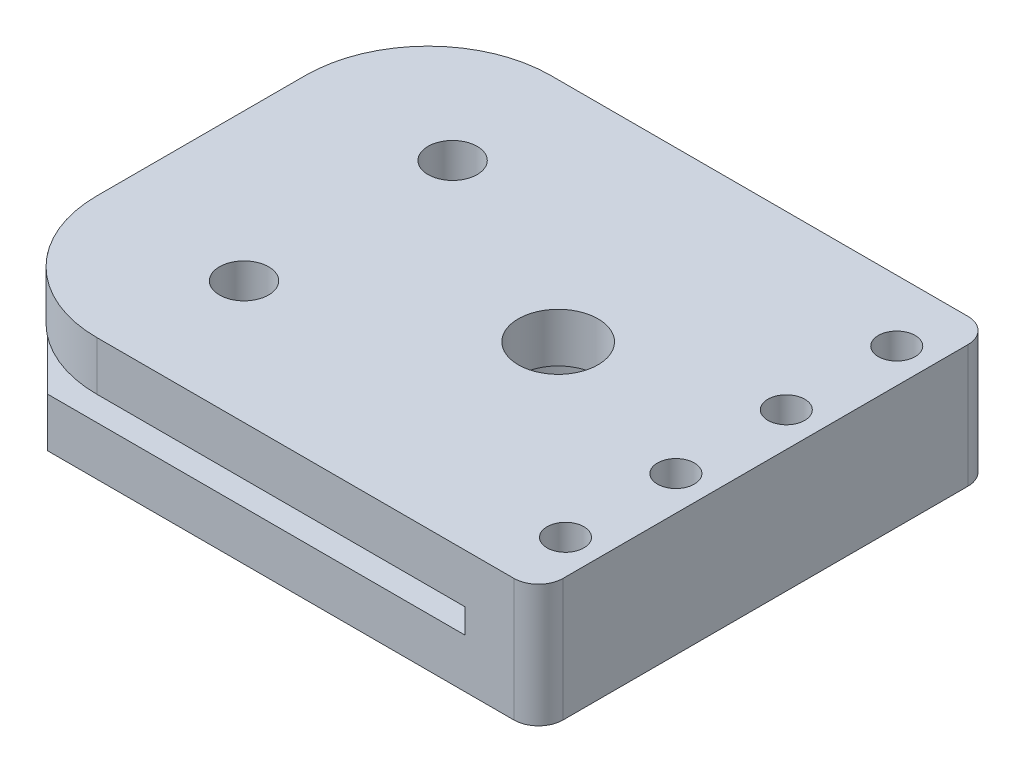
ISO-10303-21;
HEADER;
FILE_DESCRIPTION(('STEP AP214'),'2;1');
FILE_NAME('part.step','',(''),(''),'','','');
FILE_SCHEMA(('AUTOMOTIVE_DESIGN { 1 0 10303 214 1 1 1 1 }'));
ENDSEC;
DATA;
#1=APPLICATION_CONTEXT('core data for automotive mechanical design processes');
#2=APPLICATION_PROTOCOL_DEFINITION('international standard','automotive_design',2000,#1);
#3=PRODUCT_CONTEXT('',#1,'mechanical');
#4=PRODUCT('Part','Part','',(#3));
#5=PRODUCT_RELATED_PRODUCT_CATEGORY('part','',(#4));
#6=PRODUCT_DEFINITION_FORMATION('','',#4);
#7=PRODUCT_DEFINITION_CONTEXT('part definition',#1,'design');
#8=PRODUCT_DEFINITION('design','',#6,#7);
#9=PRODUCT_DEFINITION_SHAPE('','',#8);
#10=(LENGTH_UNIT() NAMED_UNIT(*) SI_UNIT(.MILLI.,.METRE.));
#11=(NAMED_UNIT(*) PLANE_ANGLE_UNIT() SI_UNIT($,.RADIAN.));
#12=(NAMED_UNIT(*) SI_UNIT($,.STERADIAN.) SOLID_ANGLE_UNIT());
#13=UNCERTAINTY_MEASURE_WITH_UNIT(LENGTH_MEASURE(1.E-05),#10,'distance_accuracy_value','');
#14=(GEOMETRIC_REPRESENTATION_CONTEXT(3) GLOBAL_UNCERTAINTY_ASSIGNED_CONTEXT((#13)) GLOBAL_UNIT_ASSIGNED_CONTEXT((#10,
#11,#12)) REPRESENTATION_CONTEXT('',''));
#15=CARTESIAN_POINT('',(0.,0.,0.));
#16=DIRECTION('',(0.,0.,1.));
#17=DIRECTION('',(1.,0.,0.));
#18=AXIS2_PLACEMENT_3D('',#15,#16,#17);
#19=CARTESIAN_POINT('',(19.,10.,-18.5));
#20=DIRECTION('',(1.,0.,0.));
#21=DIRECTION('',(0.,0.,-1.));
#22=AXIS2_PLACEMENT_3D('',#19,#20,#21);
#23=PLANE('',#22);
#24=DIRECTION('',(0.,0.,1.));
#25=VECTOR('',#24,1.);
#26=CARTESIAN_POINT('',(19.,6.,-18.5));
#27=LINE('',#26,#25);
#28=CARTESIAN_POINT('',(19.,6.,-18.5));
#29=VERTEX_POINT('',#28);
#30=CARTESIAN_POINT('',(19.,6.,18.5));
#31=VERTEX_POINT('',#30);
#32=EDGE_CURVE('E141',#29,#31,#27,.T.);
#33=ORIENTED_EDGE('',*,*,#32,.F.);
#34=DIRECTION('',(0.,-1.,0.));
#35=VECTOR('',#34,1.);
#36=CARTESIAN_POINT('',(19.,10.,-18.5));
#37=LINE('',#36,#35);
#38=CARTESIAN_POINT('',(19.,4.,-18.5));
#39=VERTEX_POINT('',#38);
#40=EDGE_CURVE('E154',#29,#39,#37,.T.);
#41=ORIENTED_EDGE('',*,*,#40,.T.);
#42=DIRECTION('',(0.,0.,1.));
#43=VECTOR('',#42,1.);
#44=CARTESIAN_POINT('',(19.,4.,-18.5));
#45=LINE('',#44,#43);
#46=CARTESIAN_POINT('',(19.,4.,18.5));
#47=VERTEX_POINT('',#46);
#48=EDGE_CURVE('E149',#39,#47,#45,.T.);
#49=ORIENTED_EDGE('',*,*,#48,.T.);
#50=DIRECTION('',(0.,-1.,0.));
#51=VECTOR('',#50,1.);
#52=CARTESIAN_POINT('',(19.,10.,18.5));
#53=LINE('',#52,#51);
#54=EDGE_CURVE('E156',#31,#47,#53,.T.);
#55=ORIENTED_EDGE('',*,*,#54,.F.);
#56=EDGE_LOOP('',(#33,#41,#49,#55));
#57=FACE_BOUND('',#56,.T.);
#58=ADVANCED_FACE('F33',(#57),#23,.F.);
#59=CARTESIAN_POINT('',(0.,4.,0.));
#60=DIRECTION('',(0.,-1.,0.));
#61=DIRECTION('',(0.,0.,-1.));
#62=AXIS2_PLACEMENT_3D('',#59,#60,#61);
#63=PLANE('',#62);
#64=CARTESIAN_POINT('',(8.10258170341882,4.,0.));
#65=DIRECTION('',(0.,-1.,0.));
#66=DIRECTION('',(0.,0.,-1.));
#67=AXIS2_PLACEMENT_3D('',#64,#65,#66);
#68=CIRCLE('',#67,7.5);
#69=CARTESIAN_POINT('',(8.10258170341882,4.,-7.5));
#70=VERTEX_POINT('',#69);
#71=EDGE_CURVE('E322',#70,#70,#68,.T.);
#72=ORIENTED_EDGE('',*,*,#71,.T.);
#73=EDGE_LOOP('',(#72));
#74=FACE_BOUND('',#73,.T.);
#75=CARTESIAN_POINT('',(-8.99999999999999,4.,-8.5));
#76=DIRECTION('',(0.,-1.,0.));
#77=DIRECTION('',(0.,0.,-1.));
#78=AXIS2_PLACEMENT_3D('',#75,#76,#77);
#79=CIRCLE('',#78,2.);
#80=CARTESIAN_POINT('',(-8.99999999999999,4.,-10.5));
#81=VERTEX_POINT('',#80);
#82=EDGE_CURVE('E313',#81,#81,#79,.T.);
#83=ORIENTED_EDGE('',*,*,#82,.T.);
#84=EDGE_LOOP('',(#83));
#85=FACE_BOUND('',#84,.T.);
#86=CARTESIAN_POINT('',(-8.99999999999999,4.,8.5));
#87=DIRECTION('',(0.,-1.,0.));
#88=DIRECTION('',(0.,0.,-1.));
#89=AXIS2_PLACEMENT_3D('',#86,#87,#88);
#90=CIRCLE('',#89,2.);
#91=CARTESIAN_POINT('',(-8.99999999999999,4.,6.5));
#92=VERTEX_POINT('',#91);
#93=EDGE_CURVE('E158',#92,#92,#90,.T.);
#94=ORIENTED_EDGE('',*,*,#93,.T.);
#95=EDGE_LOOP('',(#94));
#96=FACE_BOUND('',#95,.T.);
#97=ORIENTED_EDGE('',*,*,#48,.F.);
#98=DIRECTION('',(-1.,0.,0.));
#99=VECTOR('',#98,1.);
#100=CARTESIAN_POINT('',(-25.,4.,-18.5));
#101=LINE('',#100,#99);
#102=CARTESIAN_POINT('',(-15.,4.,-18.5));
#103=VERTEX_POINT('',#102);
#104=EDGE_CURVE('E163',#39,#103,#101,.T.);
#105=ORIENTED_EDGE('',*,*,#104,.T.);
#106=DIRECTION('',(0.707106781186549,0.,-0.707106781186546));
#107=VECTOR('',#106,1.);
#108=CARTESIAN_POINT('',(-25.,4.,-8.5));
#109=LINE('',#108,#107);
#110=CARTESIAN_POINT('',(-25.,4.,-8.49999999999999));
#111=VERTEX_POINT('',#110);
#112=EDGE_CURVE('E202',#103,#111,#109,.F.);
#113=ORIENTED_EDGE('',*,*,#112,.T.);
#114=DIRECTION('',(0.,0.,1.));
#115=VECTOR('',#114,1.);
#116=CARTESIAN_POINT('',(-25.,4.,18.5));
#117=LINE('',#116,#115);
#118=CARTESIAN_POINT('',(-25.,4.,8.49999999999996));
#119=VERTEX_POINT('',#118);
#120=EDGE_CURVE('E189',#111,#119,#117,.T.);
#121=ORIENTED_EDGE('',*,*,#120,.T.);
#122=DIRECTION('',(-0.707106781186546,0.,-0.707106781186549));
#123=VECTOR('',#122,1.);
#124=CARTESIAN_POINT('',(-15.,4.,18.5));
#125=LINE('',#124,#123);
#126=CARTESIAN_POINT('',(-15.,4.,18.5));
#127=VERTEX_POINT('',#126);
#128=EDGE_CURVE('E200',#119,#127,#125,.F.);
#129=ORIENTED_EDGE('',*,*,#128,.T.);
#130=DIRECTION('',(1.,0.,0.));
#131=VECTOR('',#130,1.);
#132=CARTESIAN_POINT('',(-25.,4.,18.5));
#133=LINE('',#132,#131);
#134=EDGE_CURVE('E192',#127,#47,#133,.T.);
#135=ORIENTED_EDGE('',*,*,#134,.T.);
#136=EDGE_LOOP('',(#97,#105,#113,#121,#129,#135));
#137=FACE_BOUND('',#136,.T.);
#138=ADVANCED_FACE('F233',(#74,#85,#96,#137),#63,.F.);
#139=CARTESIAN_POINT('',(25.,4.,18.5));
#140=DIRECTION('',(-1.,0.,0.));
#141=DIRECTION('',(0.,0.,1.));
#142=AXIS2_PLACEMENT_3D('',#139,#140,#141);
#143=PLANE('',#142);
#144=DIRECTION('',(0.,0.,-1.));
#145=VECTOR('',#144,1.);
#146=CARTESIAN_POINT('',(25.,10.,-18.5));
#147=LINE('',#146,#145);
#148=CARTESIAN_POINT('',(25.,10.,16.5));
#149=VERTEX_POINT('',#148);
#150=CARTESIAN_POINT('',(25.,10.,-16.5));
#151=VERTEX_POINT('',#150);
#152=EDGE_CURVE('E181',#149,#151,#147,.T.);
#153=ORIENTED_EDGE('',*,*,#152,.F.);
#154=DIRECTION('',(0.,-1.,0.));
#155=VECTOR('',#154,1.);
#156=CARTESIAN_POINT('',(25.,4.,16.5));
#157=LINE('',#156,#155);
#158=CARTESIAN_POINT('',(25.,0.,16.5));
#159=VERTEX_POINT('',#158);
#160=EDGE_CURVE('E262',#149,#159,#157,.T.);
#161=ORIENTED_EDGE('',*,*,#160,.T.);
#162=DIRECTION('',(0.,0.,-1.));
#163=VECTOR('',#162,1.);
#164=CARTESIAN_POINT('',(25.,0.,18.5));
#165=LINE('',#164,#163);
#166=CARTESIAN_POINT('',(25.,0.,-16.5));
#167=VERTEX_POINT('',#166);
#168=EDGE_CURVE('E164',#159,#167,#165,.T.);
#169=ORIENTED_EDGE('',*,*,#168,.T.);
#170=DIRECTION('',(0.,-1.,0.));
#171=VECTOR('',#170,1.);
#172=CARTESIAN_POINT('',(25.,4.,-16.5));
#173=LINE('',#172,#171);
#174=EDGE_CURVE('E271',#167,#151,#173,.F.);
#175=ORIENTED_EDGE('',*,*,#174,.T.);
#176=EDGE_LOOP('',(#153,#161,#169,#175));
#177=FACE_BOUND('',#176,.T.);
#178=ADVANCED_FACE('F399',(#177),#143,.F.);
#179=CARTESIAN_POINT('',(-25.,4.,-18.5));
#180=DIRECTION('',(0.,0.,1.));
#181=DIRECTION('',(1.,0.,0.));
#182=AXIS2_PLACEMENT_3D('',#179,#180,#181);
#183=PLANE('',#182);
#184=DIRECTION('',(-1.,0.,0.));
#185=VECTOR('',#184,1.);
#186=CARTESIAN_POINT('',(25.,10.,-18.5));
#187=LINE('',#186,#185);
#188=CARTESIAN_POINT('',(23.,10.,-18.5));
#189=VERTEX_POINT('',#188);
#190=CARTESIAN_POINT('',(-11.,10.,-18.5));
#191=VERTEX_POINT('',#190);
#192=EDGE_CURVE('E252',#189,#191,#187,.T.);
#193=ORIENTED_EDGE('',*,*,#192,.F.);
#194=DIRECTION('',(0.,-1.,0.));
#195=VECTOR('',#194,1.);
#196=CARTESIAN_POINT('',(23.,4.,-18.5));
#197=LINE('',#196,#195);
#198=CARTESIAN_POINT('',(23.,0.,-18.5));
#199=VERTEX_POINT('',#198);
#200=EDGE_CURVE('E11',#189,#199,#197,.T.);
#201=ORIENTED_EDGE('',*,*,#200,.T.);
#202=DIRECTION('',(-1.,0.,0.));
#203=VECTOR('',#202,1.);
#204=CARTESIAN_POINT('',(-25.,0.,-18.5));
#205=LINE('',#204,#203);
#206=CARTESIAN_POINT('',(-15.,0.,-18.5));
#207=VERTEX_POINT('',#206);
#208=EDGE_CURVE('E167',#199,#207,#205,.T.);
#209=ORIENTED_EDGE('',*,*,#208,.T.);
#210=DIRECTION('',(0.,1.,0.));
#211=VECTOR('',#210,1.);
#212=CARTESIAN_POINT('',(-15.,4.,-18.5));
#213=LINE('',#212,#211);
#214=EDGE_CURVE('E198',#207,#103,#213,.T.);
#215=ORIENTED_EDGE('',*,*,#214,.T.);
#216=ORIENTED_EDGE('',*,*,#104,.F.);
#217=ORIENTED_EDGE('',*,*,#40,.F.);
#218=DIRECTION('',(1.,0.,0.));
#219=VECTOR('',#218,1.);
#220=CARTESIAN_POINT('',(-21.,6.,-18.5));
#221=LINE('',#220,#219);
#222=CARTESIAN_POINT('',(-11.,6.,-18.5));
#223=VERTEX_POINT('',#222);
#224=EDGE_CURVE('E137',#223,#29,#221,.T.);
#225=ORIENTED_EDGE('',*,*,#224,.F.);
#226=DIRECTION('',(0.,-1.,0.));
#227=VECTOR('',#226,1.);
#228=CARTESIAN_POINT('',(-11.,10.,-18.5));
#229=LINE('',#228,#227);
#230=EDGE_CURVE('E273',#223,#191,#229,.F.);
#231=ORIENTED_EDGE('',*,*,#230,.T.);
#232=EDGE_LOOP('',(#193,#201,#209,#215,#216,#217,#225,#231));
#233=FACE_BOUND('',#232,.T.);
#234=ADVANCED_FACE('F161',(#233),#183,.F.);
#235=CARTESIAN_POINT('',(-25.,4.,18.5));
#236=DIRECTION('',(1.,0.,0.));
#237=DIRECTION('',(0.,0.,-1.));
#238=AXIS2_PLACEMENT_3D('',#235,#236,#237);
#239=PLANE('',#238);
#240=DIRECTION('',(0.,0.,1.));
#241=VECTOR('',#240,1.);
#242=CARTESIAN_POINT('',(-25.,0.,18.5));
#243=LINE('',#242,#241);
#244=CARTESIAN_POINT('',(-25.,0.,-8.49999999999999));
#245=VERTEX_POINT('',#244);
#246=CARTESIAN_POINT('',(-25.,0.,8.49999999999996));
#247=VERTEX_POINT('',#246);
#248=EDGE_CURVE('E218',#245,#247,#243,.T.);
#249=ORIENTED_EDGE('',*,*,#248,.T.);
#250=DIRECTION('',(0.,1.,0.));
#251=VECTOR('',#250,1.);
#252=CARTESIAN_POINT('',(-25.,4.,8.49999999999996));
#253=LINE('',#252,#251);
#254=EDGE_CURVE('E204',#247,#119,#253,.T.);
#255=ORIENTED_EDGE('',*,*,#254,.T.);
#256=ORIENTED_EDGE('',*,*,#120,.F.);
#257=DIRECTION('',(0.,-1.,0.));
#258=VECTOR('',#257,1.);
#259=CARTESIAN_POINT('',(-25.,4.,-8.5));
#260=LINE('',#259,#258);
#261=EDGE_CURVE('E206',#111,#245,#260,.T.);
#262=ORIENTED_EDGE('',*,*,#261,.T.);
#263=EDGE_LOOP('',(#249,#255,#256,#262));
#264=FACE_BOUND('',#263,.T.);
#265=ADVANCED_FACE('F236',(#264),#239,.F.);
#266=CARTESIAN_POINT('',(-25.,4.,18.5));
#267=DIRECTION('',(0.,0.,-1.));
#268=DIRECTION('',(-1.,0.,0.));
#269=AXIS2_PLACEMENT_3D('',#266,#267,#268);
#270=PLANE('',#269);
#271=DIRECTION('',(1.,0.,0.));
#272=VECTOR('',#271,1.);
#273=CARTESIAN_POINT('',(-25.,0.,18.5));
#274=LINE('',#273,#272);
#275=CARTESIAN_POINT('',(-15.,0.,18.5));
#276=VERTEX_POINT('',#275);
#277=CARTESIAN_POINT('',(23.,0.,18.5));
#278=VERTEX_POINT('',#277);
#279=EDGE_CURVE('E216',#276,#278,#274,.T.);
#280=ORIENTED_EDGE('',*,*,#279,.T.);
#281=DIRECTION('',(0.,-1.,0.));
#282=VECTOR('',#281,1.);
#283=CARTESIAN_POINT('',(23.,4.,18.5));
#284=LINE('',#283,#282);
#285=CARTESIAN_POINT('',(23.,10.,18.5));
#286=VERTEX_POINT('',#285);
#287=EDGE_CURVE('E56',#278,#286,#284,.F.);
#288=ORIENTED_EDGE('',*,*,#287,.T.);
#289=DIRECTION('',(1.,0.,0.));
#290=VECTOR('',#289,1.);
#291=CARTESIAN_POINT('',(25.,10.,18.5));
#292=LINE('',#291,#290);
#293=CARTESIAN_POINT('',(-11.,10.,18.5));
#294=VERTEX_POINT('',#293);
#295=EDGE_CURVE('E169',#294,#286,#292,.T.);
#296=ORIENTED_EDGE('',*,*,#295,.F.);
#297=DIRECTION('',(0.,1.,0.));
#298=VECTOR('',#297,1.);
#299=CARTESIAN_POINT('',(-11.,6.,18.5));
#300=LINE('',#299,#298);
#301=CARTESIAN_POINT('',(-11.,6.,18.5));
#302=VERTEX_POINT('',#301);
#303=EDGE_CURVE('E245',#294,#302,#300,.F.);
#304=ORIENTED_EDGE('',*,*,#303,.T.);
#305=DIRECTION('',(1.,0.,0.));
#306=VECTOR('',#305,1.);
#307=CARTESIAN_POINT('',(-21.,6.,18.5));
#308=LINE('',#307,#306);
#309=EDGE_CURVE('E150',#302,#31,#308,.T.);
#310=ORIENTED_EDGE('',*,*,#309,.T.);
#311=ORIENTED_EDGE('',*,*,#54,.T.);
#312=ORIENTED_EDGE('',*,*,#134,.F.);
#313=DIRECTION('',(0.,-1.,0.));
#314=VECTOR('',#313,1.);
#315=CARTESIAN_POINT('',(-15.,4.,18.5));
#316=LINE('',#315,#314);
#317=EDGE_CURVE('E197',#127,#276,#316,.T.);
#318=ORIENTED_EDGE('',*,*,#317,.T.);
#319=EDGE_LOOP('',(#280,#288,#296,#304,#310,#311,#312,#318));
#320=FACE_BOUND('',#319,.T.);
#321=ADVANCED_FACE('F242',(#320),#270,.F.);
#322=CARTESIAN_POINT('',(0.,0.,0.));
#323=DIRECTION('',(0.,-1.,0.));
#324=DIRECTION('',(0.,0.,-1.));
#325=AXIS2_PLACEMENT_3D('',#322,#323,#324);
#326=PLANE('',#325);
#327=CARTESIAN_POINT('',(8.10258170341882,0.,0.));
#328=DIRECTION('',(0.,-1.,0.));
#329=DIRECTION('',(0.,0.,-1.));
#330=AXIS2_PLACEMENT_3D('',#327,#328,#329);
#331=CIRCLE('',#330,7.5);
#332=CARTESIAN_POINT('',(8.10258170341882,0.,-7.5));
#333=VERTEX_POINT('',#332);
#334=EDGE_CURVE('E325',#333,#333,#331,.T.);
#335=ORIENTED_EDGE('',*,*,#334,.F.);
#336=EDGE_LOOP('',(#335));
#337=FACE_BOUND('',#336,.T.);
#338=CARTESIAN_POINT('',(-8.99999999999999,0.,-8.5));
#339=DIRECTION('',(0.,-1.,0.));
#340=DIRECTION('',(0.,0.,-1.));
#341=AXIS2_PLACEMENT_3D('',#338,#339,#340);
#342=CIRCLE('',#341,2.);
#343=CARTESIAN_POINT('',(-8.99999999999999,0.,-10.5));
#344=VERTEX_POINT('',#343);
#345=EDGE_CURVE('E282',#344,#344,#342,.T.);
#346=ORIENTED_EDGE('',*,*,#345,.F.);
#347=EDGE_LOOP('',(#346));
#348=FACE_BOUND('',#347,.T.);
#349=CARTESIAN_POINT('',(-8.99999999999999,0.,8.5));
#350=DIRECTION('',(0.,-1.,0.));
#351=DIRECTION('',(0.,0.,-1.));
#352=AXIS2_PLACEMENT_3D('',#349,#350,#351);
#353=CIRCLE('',#352,2.);
#354=CARTESIAN_POINT('',(-8.99999999999999,0.,6.5));
#355=VERTEX_POINT('',#354);
#356=EDGE_CURVE('E286',#355,#355,#353,.T.);
#357=ORIENTED_EDGE('',*,*,#356,.F.);
#358=EDGE_LOOP('',(#357));
#359=FACE_BOUND('',#358,.T.);
#360=ORIENTED_EDGE('',*,*,#168,.F.);
#361=CARTESIAN_POINT('',(23.,0.,16.5));
#362=DIRECTION('',(0.,-1.,0.));
#363=DIRECTION('',(0.,0.,-1.));
#364=AXIS2_PLACEMENT_3D('',#361,#362,#363);
#365=CIRCLE('',#364,2.);
#366=EDGE_CURVE('E266',#159,#278,#365,.T.);
#367=ORIENTED_EDGE('',*,*,#366,.T.);
#368=ORIENTED_EDGE('',*,*,#279,.F.);
#369=DIRECTION('',(0.707106781186546,0.,0.707106781186549));
#370=VECTOR('',#369,1.);
#371=CARTESIAN_POINT('',(-16.75,0.,16.75));
#372=LINE('',#371,#370);
#373=EDGE_CURVE('E209',#276,#247,#372,.F.);
#374=ORIENTED_EDGE('',*,*,#373,.T.);
#375=ORIENTED_EDGE('',*,*,#248,.F.);
#376=DIRECTION('',(-0.707106781186549,0.,0.707106781186546));
#377=VECTOR('',#376,1.);
#378=CARTESIAN_POINT('',(-16.75,0.,-16.75));
#379=LINE('',#378,#377);
#380=EDGE_CURVE('E211',#245,#207,#379,.F.);
#381=ORIENTED_EDGE('',*,*,#380,.T.);
#382=ORIENTED_EDGE('',*,*,#208,.F.);
#383=CARTESIAN_POINT('',(23.,0.,-16.5));
#384=DIRECTION('',(0.,-1.,0.));
#385=DIRECTION('',(0.,0.,-1.));
#386=AXIS2_PLACEMENT_3D('',#383,#384,#385);
#387=CIRCLE('',#386,2.);
#388=EDGE_CURVE('E268',#199,#167,#387,.T.);
#389=ORIENTED_EDGE('',*,*,#388,.T.);
#390=EDGE_LOOP('',(#360,#367,#368,#374,#375,#381,#382,#389));
#391=FACE_BOUND('',#390,.T.);
#392=ADVANCED_FACE('F227',(#337,#348,#359,#391),#326,.T.);
#393=CARTESIAN_POINT('',(-15.,4.,18.5));
#394=DIRECTION('',(0.707106781186549,0.,-0.707106781186546));
#395=DIRECTION('',(0.,-1.,0.));
#396=AXIS2_PLACEMENT_3D('',#393,#394,#395);
#397=PLANE('',#396);
#398=ORIENTED_EDGE('',*,*,#128,.F.);
#399=ORIENTED_EDGE('',*,*,#254,.F.);
#400=ORIENTED_EDGE('',*,*,#373,.F.);
#401=ORIENTED_EDGE('',*,*,#317,.F.);
#402=EDGE_LOOP('',(#398,#399,#400,#401));
#403=FACE_BOUND('',#402,.T.);
#404=ADVANCED_FACE('F239',(#403),#397,.F.);
#405=CARTESIAN_POINT('',(-25.,4.,-8.5));
#406=DIRECTION('',(0.707106781186546,0.,0.707106781186549));
#407=DIRECTION('',(0.,-1.,0.));
#408=AXIS2_PLACEMENT_3D('',#405,#406,#407);
#409=PLANE('',#408);
#410=ORIENTED_EDGE('',*,*,#112,.F.);
#411=ORIENTED_EDGE('',*,*,#214,.F.);
#412=ORIENTED_EDGE('',*,*,#380,.F.);
#413=ORIENTED_EDGE('',*,*,#261,.F.);
#414=EDGE_LOOP('',(#410,#411,#412,#413));
#415=FACE_BOUND('',#414,.T.);
#416=ADVANCED_FACE('F230',(#415),#409,.F.);
#417=CARTESIAN_POINT('',(0.,10.,0.));
#418=DIRECTION('',(0.,-1.,0.));
#419=DIRECTION('',(0.,0.,-1.));
#420=AXIS2_PLACEMENT_3D('',#417,#418,#419);
#421=PLANE('',#420);
#422=CARTESIAN_POINT('',(22.2,10.,13.5));
#423=DIRECTION('',(0.,1.,0.));
#424=DIRECTION('',(0.,0.,1.));
#425=AXIS2_PLACEMENT_3D('',#422,#423,#424);
#426=CIRCLE('',#425,1.5);
#427=CARTESIAN_POINT('',(22.2,10.,15.));
#428=VERTEX_POINT('',#427);
#429=EDGE_CURVE('E347',#428,#428,#426,.T.);
#430=ORIENTED_EDGE('',*,*,#429,.F.);
#431=EDGE_LOOP('',(#430));
#432=FACE_BOUND('',#431,.T.);
#433=CARTESIAN_POINT('',(22.2,10.,4.5));
#434=DIRECTION('',(0.,1.,0.));
#435=DIRECTION('',(0.,0.,1.));
#436=AXIS2_PLACEMENT_3D('',#433,#434,#435);
#437=CIRCLE('',#436,1.5);
#438=CARTESIAN_POINT('',(22.2,10.,6.));
#439=VERTEX_POINT('',#438);
#440=EDGE_CURVE('E341',#439,#439,#437,.T.);
#441=ORIENTED_EDGE('',*,*,#440,.F.);
#442=EDGE_LOOP('',(#441));
#443=FACE_BOUND('',#442,.T.);
#444=CARTESIAN_POINT('',(22.2,10.,-4.5));
#445=DIRECTION('',(0.,1.,0.));
#446=DIRECTION('',(0.,0.,1.));
#447=AXIS2_PLACEMENT_3D('',#444,#445,#446);
#448=CIRCLE('',#447,1.5);
#449=CARTESIAN_POINT('',(22.2,10.,-3.));
#450=VERTEX_POINT('',#449);
#451=EDGE_CURVE('E335',#450,#450,#448,.T.);
#452=ORIENTED_EDGE('',*,*,#451,.F.);
#453=EDGE_LOOP('',(#452));
#454=FACE_BOUND('',#453,.T.);
#455=CARTESIAN_POINT('',(22.2,10.,-13.5));
#456=DIRECTION('',(0.,1.,0.));
#457=DIRECTION('',(0.,0.,1.));
#458=AXIS2_PLACEMENT_3D('',#455,#456,#457);
#459=CIRCLE('',#458,1.5);
#460=CARTESIAN_POINT('',(22.2,10.,-12.));
#461=VERTEX_POINT('',#460);
#462=EDGE_CURVE('E329',#461,#461,#459,.T.);
#463=ORIENTED_EDGE('',*,*,#462,.F.);
#464=EDGE_LOOP('',(#463));
#465=FACE_BOUND('',#464,.T.);
#466=CARTESIAN_POINT('',(8.10258170341882,10.,0.));
#467=DIRECTION('',(0.,1.,0.));
#468=DIRECTION('',(0.,0.,1.));
#469=AXIS2_PLACEMENT_3D('',#466,#467,#468);
#470=CIRCLE('',#469,3.25);
#471=CARTESIAN_POINT('',(8.10258170341882,10.,3.25));
#472=VERTEX_POINT('',#471);
#473=EDGE_CURVE('E278',#472,#472,#470,.T.);
#474=ORIENTED_EDGE('',*,*,#473,.F.);
#475=EDGE_LOOP('',(#474));
#476=FACE_BOUND('',#475,.T.);
#477=CARTESIAN_POINT('',(-8.99999999999999,10.,-8.5));
#478=DIRECTION('',(0.,1.,0.));
#479=DIRECTION('',(0.,0.,1.));
#480=AXIS2_PLACEMENT_3D('',#477,#478,#479);
#481=CIRCLE('',#480,2.);
#482=CARTESIAN_POINT('',(-8.99999999999999,10.,-6.5));
#483=VERTEX_POINT('',#482);
#484=EDGE_CURVE('E277',#483,#483,#481,.T.);
#485=ORIENTED_EDGE('',*,*,#484,.F.);
#486=EDGE_LOOP('',(#485));
#487=FACE_BOUND('',#486,.T.);
#488=CARTESIAN_POINT('',(-8.99999999999999,10.,8.5));
#489=DIRECTION('',(0.,1.,0.));
#490=DIRECTION('',(0.,0.,1.));
#491=AXIS2_PLACEMENT_3D('',#488,#489,#490);
#492=CIRCLE('',#491,2.);
#493=CARTESIAN_POINT('',(-8.99999999999999,10.,10.5));
#494=VERTEX_POINT('',#493);
#495=EDGE_CURVE('E287',#494,#494,#492,.T.);
#496=ORIENTED_EDGE('',*,*,#495,.F.);
#497=EDGE_LOOP('',(#496));
#498=FACE_BOUND('',#497,.T.);
#499=ORIENTED_EDGE('',*,*,#295,.T.);
#500=CARTESIAN_POINT('',(23.,10.,16.5));
#501=DIRECTION('',(0.,-1.,0.));
#502=DIRECTION('',(0.,0.,-1.));
#503=AXIS2_PLACEMENT_3D('',#500,#501,#502);
#504=CIRCLE('',#503,2.);
#505=EDGE_CURVE('E41',#286,#149,#504,.F.);
#506=ORIENTED_EDGE('',*,*,#505,.T.);
#507=ORIENTED_EDGE('',*,*,#152,.T.);
#508=CARTESIAN_POINT('',(23.,10.,-16.5));
#509=DIRECTION('',(0.,-1.,0.));
#510=DIRECTION('',(0.,0.,-1.));
#511=AXIS2_PLACEMENT_3D('',#508,#509,#510);
#512=CIRCLE('',#511,2.);
#513=EDGE_CURVE('E48',#151,#189,#512,.F.);
#514=ORIENTED_EDGE('',*,*,#513,.T.);
#515=ORIENTED_EDGE('',*,*,#192,.T.);
#516=CARTESIAN_POINT('',(-11.,10.,-8.5));
#517=DIRECTION('',(0.,-1.,0.));
#518=DIRECTION('',(0.,0.,-1.));
#519=AXIS2_PLACEMENT_3D('',#516,#517,#518);
#520=CIRCLE('',#519,10.);
#521=CARTESIAN_POINT('',(-21.,10.,-8.5));
#522=VERTEX_POINT('',#521);
#523=EDGE_CURVE('E294',#191,#522,#520,.F.);
#524=ORIENTED_EDGE('',*,*,#523,.T.);
#525=DIRECTION('',(0.,0.,-1.));
#526=VECTOR('',#525,1.);
#527=CARTESIAN_POINT('',(-21.,10.,-18.5));
#528=LINE('',#527,#526);
#529=CARTESIAN_POINT('',(-21.,10.,8.5));
#530=VERTEX_POINT('',#529);
#531=EDGE_CURVE('E247',#530,#522,#528,.T.);
#532=ORIENTED_EDGE('',*,*,#531,.F.);
#533=CARTESIAN_POINT('',(-11.,10.,8.5));
#534=DIRECTION('',(0.,-1.,0.));
#535=DIRECTION('',(0.,0.,-1.));
#536=AXIS2_PLACEMENT_3D('',#533,#534,#535);
#537=CIRCLE('',#536,10.);
#538=EDGE_CURVE('E257',#530,#294,#537,.F.);
#539=ORIENTED_EDGE('',*,*,#538,.T.);
#540=EDGE_LOOP('',(#499,#506,#507,#514,#515,#524,#532,#539));
#541=FACE_BOUND('',#540,.T.);
#542=ADVANCED_FACE('F254',(#432,#443,#454,#465,#476,#487,#498,#541),#421,.F.);
#543=CARTESIAN_POINT('',(-21.,6.,-18.5));
#544=DIRECTION('',(0.,1.,0.));
#545=DIRECTION('',(0.,0.,1.));
#546=AXIS2_PLACEMENT_3D('',#543,#544,#545);
#547=PLANE('',#546);
#548=CARTESIAN_POINT('',(8.10258170341882,6.,0.));
#549=DIRECTION('',(0.,1.,0.));
#550=DIRECTION('',(0.,0.,1.));
#551=AXIS2_PLACEMENT_3D('',#548,#549,#550);
#552=CIRCLE('',#551,3.25);
#553=CARTESIAN_POINT('',(8.10258170341882,6.,3.25));
#554=VERTEX_POINT('',#553);
#555=EDGE_CURVE('E274',#554,#554,#552,.T.);
#556=ORIENTED_EDGE('',*,*,#555,.T.);
#557=EDGE_LOOP('',(#556));
#558=FACE_BOUND('',#557,.T.);
#559=CARTESIAN_POINT('',(-8.99999999999999,6.,-8.5));
#560=DIRECTION('',(0.,1.,0.));
#561=DIRECTION('',(0.,0.,1.));
#562=AXIS2_PLACEMENT_3D('',#559,#560,#561);
#563=CIRCLE('',#562,2.);
#564=CARTESIAN_POINT('',(-8.99999999999999,6.,-6.5));
#565=VERTEX_POINT('',#564);
#566=EDGE_CURVE('E279',#565,#565,#563,.T.);
#567=ORIENTED_EDGE('',*,*,#566,.T.);
#568=EDGE_LOOP('',(#567));
#569=FACE_BOUND('',#568,.T.);
#570=CARTESIAN_POINT('',(-8.99999999999999,6.,8.5));
#571=DIRECTION('',(0.,1.,0.));
#572=DIRECTION('',(0.,0.,1.));
#573=AXIS2_PLACEMENT_3D('',#570,#571,#572);
#574=CIRCLE('',#573,2.);
#575=CARTESIAN_POINT('',(-8.99999999999999,6.,10.5));
#576=VERTEX_POINT('',#575);
#577=EDGE_CURVE('E283',#576,#576,#574,.T.);
#578=ORIENTED_EDGE('',*,*,#577,.T.);
#579=EDGE_LOOP('',(#578));
#580=FACE_BOUND('',#579,.T.);
#581=ORIENTED_EDGE('',*,*,#309,.F.);
#582=CARTESIAN_POINT('',(-11.,6.,8.5));
#583=DIRECTION('',(0.,1.,0.));
#584=DIRECTION('',(0.,0.,1.));
#585=AXIS2_PLACEMENT_3D('',#582,#583,#584);
#586=CIRCLE('',#585,10.);
#587=CARTESIAN_POINT('',(-21.,6.,8.5));
#588=VERTEX_POINT('',#587);
#589=EDGE_CURVE('E289',#302,#588,#586,.F.);
#590=ORIENTED_EDGE('',*,*,#589,.T.);
#591=DIRECTION('',(0.,0.,1.));
#592=VECTOR('',#591,1.);
#593=CARTESIAN_POINT('',(-21.,6.,-18.5));
#594=LINE('',#593,#592);
#595=CARTESIAN_POINT('',(-21.,6.,-8.5));
#596=VERTEX_POINT('',#595);
#597=EDGE_CURVE('E157',#596,#588,#594,.T.);
#598=ORIENTED_EDGE('',*,*,#597,.F.);
#599=CARTESIAN_POINT('',(-11.,6.,-8.5));
#600=DIRECTION('',(0.,1.,0.));
#601=DIRECTION('',(0.,0.,1.));
#602=AXIS2_PLACEMENT_3D('',#599,#600,#601);
#603=CIRCLE('',#602,10.);
#604=EDGE_CURVE('E144',#596,#223,#603,.F.);
#605=ORIENTED_EDGE('',*,*,#604,.T.);
#606=ORIENTED_EDGE('',*,*,#224,.T.);
#607=ORIENTED_EDGE('',*,*,#32,.T.);
#608=EDGE_LOOP('',(#581,#590,#598,#605,#606,#607));
#609=FACE_BOUND('',#608,.T.);
#610=ADVANCED_FACE('F140',(#558,#569,#580,#609),#547,.F.);
#611=CARTESIAN_POINT('',(-21.,0.,0.));
#612=DIRECTION('',(-1.,0.,0.));
#613=DIRECTION('',(0.,0.,1.));
#614=AXIS2_PLACEMENT_3D('',#611,#612,#613);
#615=PLANE('',#614);
#616=ORIENTED_EDGE('',*,*,#597,.T.);
#617=DIRECTION('',(0.,1.,0.));
#618=VECTOR('',#617,1.);
#619=CARTESIAN_POINT('',(-21.,10.,8.5));
#620=LINE('',#619,#618);
#621=EDGE_CURVE('E295',#588,#530,#620,.T.);
#622=ORIENTED_EDGE('',*,*,#621,.T.);
#623=ORIENTED_EDGE('',*,*,#531,.T.);
#624=DIRECTION('',(0.,-1.,0.));
#625=VECTOR('',#624,1.);
#626=CARTESIAN_POINT('',(-21.,6.,-8.5));
#627=LINE('',#626,#625);
#628=EDGE_CURVE('E174',#522,#596,#627,.T.);
#629=ORIENTED_EDGE('',*,*,#628,.T.);
#630=EDGE_LOOP('',(#616,#622,#623,#629));
#631=FACE_BOUND('',#630,.T.);
#632=ADVANCED_FACE('F302',(#631),#615,.T.);
#633=CARTESIAN_POINT('',(-11.,0.,8.5));
#634=DIRECTION('',(0.,-1.,0.));
#635=DIRECTION('',(0.,0.,-1.));
#636=AXIS2_PLACEMENT_3D('',#633,#634,#635);
#637=CYLINDRICAL_SURFACE('',#636,10.);
#638=ORIENTED_EDGE('',*,*,#589,.F.);
#639=ORIENTED_EDGE('',*,*,#303,.F.);
#640=ORIENTED_EDGE('',*,*,#538,.F.);
#641=ORIENTED_EDGE('',*,*,#621,.F.);
#642=EDGE_LOOP('',(#638,#639,#640,#641));
#643=FACE_BOUND('',#642,.T.);
#644=ADVANCED_FACE('F391',(#643),#637,.T.);
#645=CARTESIAN_POINT('',(-11.,0.,-8.5));
#646=DIRECTION('',(0.,1.,0.));
#647=DIRECTION('',(0.,0.,1.));
#648=AXIS2_PLACEMENT_3D('',#645,#646,#647);
#649=CYLINDRICAL_SURFACE('',#648,10.);
#650=ORIENTED_EDGE('',*,*,#523,.F.);
#651=ORIENTED_EDGE('',*,*,#230,.F.);
#652=ORIENTED_EDGE('',*,*,#604,.F.);
#653=ORIENTED_EDGE('',*,*,#628,.F.);
#654=EDGE_LOOP('',(#650,#651,#652,#653));
#655=FACE_BOUND('',#654,.T.);
#656=ADVANCED_FACE('F381',(#655),#649,.T.);
#657=CARTESIAN_POINT('',(-8.99999999999999,-30.,8.5));
#658=DIRECTION('',(0.,1.,0.));
#659=DIRECTION('',(0.,0.,1.));
#660=AXIS2_PLACEMENT_3D('',#657,#658,#659);
#661=CYLINDRICAL_SURFACE('',#660,2.);
#662=ORIENTED_EDGE('',*,*,#495,.T.);
#663=EDGE_LOOP('',(#662));
#664=FACE_BOUND('',#663,.T.);
#665=ORIENTED_EDGE('',*,*,#577,.F.);
#666=EDGE_LOOP('',(#665));
#667=FACE_BOUND('',#666,.T.);
#668=ADVANCED_FACE('F377',(#664,#667),#661,.F.);
#669=ORIENTED_EDGE('',*,*,#356,.T.);
#670=EDGE_LOOP('',(#669));
#671=FACE_BOUND('',#670,.T.);
#672=ORIENTED_EDGE('',*,*,#93,.F.);
#673=EDGE_LOOP('',(#672));
#674=FACE_BOUND('',#673,.T.);
#675=ADVANCED_FACE('F380',(#671,#674),#661,.F.);
#676=CARTESIAN_POINT('',(-8.99999999999999,-30.,-8.5));
#677=DIRECTION('',(0.,1.,0.));
#678=DIRECTION('',(0.,0.,1.));
#679=AXIS2_PLACEMENT_3D('',#676,#677,#678);
#680=CYLINDRICAL_SURFACE('',#679,2.);
#681=ORIENTED_EDGE('',*,*,#484,.T.);
#682=EDGE_LOOP('',(#681));
#683=FACE_BOUND('',#682,.T.);
#684=ORIENTED_EDGE('',*,*,#566,.F.);
#685=EDGE_LOOP('',(#684));
#686=FACE_BOUND('',#685,.T.);
#687=ADVANCED_FACE('F466',(#683,#686),#680,.F.);
#688=ORIENTED_EDGE('',*,*,#345,.T.);
#689=EDGE_LOOP('',(#688));
#690=FACE_BOUND('',#689,.T.);
#691=ORIENTED_EDGE('',*,*,#82,.F.);
#692=EDGE_LOOP('',(#691));
#693=FACE_BOUND('',#692,.T.);
#694=ADVANCED_FACE('F463',(#690,#693),#680,.F.);
#695=CARTESIAN_POINT('',(8.10258170341882,-30.,0.));
#696=DIRECTION('',(0.,1.,0.));
#697=DIRECTION('',(0.,0.,1.));
#698=AXIS2_PLACEMENT_3D('',#695,#696,#697);
#699=CYLINDRICAL_SURFACE('',#698,3.25);
#700=ORIENTED_EDGE('',*,*,#473,.T.);
#701=EDGE_LOOP('',(#700));
#702=FACE_BOUND('',#701,.T.);
#703=ORIENTED_EDGE('',*,*,#555,.F.);
#704=EDGE_LOOP('',(#703));
#705=FACE_BOUND('',#704,.T.);
#706=ADVANCED_FACE('F459',(#702,#705),#699,.F.);
#707=CARTESIAN_POINT('',(8.10258170341882,5.,0.));
#708=DIRECTION('',(0.,-1.,0.));
#709=DIRECTION('',(0.,0.,-1.));
#710=AXIS2_PLACEMENT_3D('',#707,#708,#709);
#711=CYLINDRICAL_SURFACE('',#710,7.5);
#712=ORIENTED_EDGE('',*,*,#334,.T.);
#713=EDGE_LOOP('',(#712));
#714=FACE_BOUND('',#713,.T.);
#715=ORIENTED_EDGE('',*,*,#71,.F.);
#716=EDGE_LOOP('',(#715));
#717=FACE_BOUND('',#716,.T.);
#718=ADVANCED_FACE('F455',(#714,#717),#711,.F.);
#719=CARTESIAN_POINT('',(22.2,1.,-13.5));
#720=DIRECTION('',(0.,1.,0.));
#721=DIRECTION('',(0.,0.,1.));
#722=AXIS2_PLACEMENT_3D('',#719,#720,#721);
#723=CYLINDRICAL_SURFACE('',#722,1.5);
#724=CARTESIAN_POINT('',(22.2,1.,-13.5));
#725=DIRECTION('',(0.,1.,0.));
#726=DIRECTION('',(0.,0.,1.));
#727=AXIS2_PLACEMENT_3D('',#724,#725,#726);
#728=CIRCLE('',#727,1.5);
#729=CARTESIAN_POINT('',(22.2,1.,-12.));
#730=VERTEX_POINT('',#729);
#731=EDGE_CURVE('E328',#730,#730,#728,.T.);
#732=ORIENTED_EDGE('',*,*,#731,.F.);
#733=EDGE_LOOP('',(#732));
#734=FACE_BOUND('',#733,.T.);
#735=ORIENTED_EDGE('',*,*,#462,.T.);
#736=EDGE_LOOP('',(#735));
#737=FACE_BOUND('',#736,.T.);
#738=ADVANCED_FACE('F451',(#734,#737),#723,.F.);
#739=CARTESIAN_POINT('',(22.2,1.,-13.5));
#740=DIRECTION('',(0.,1.,0.));
#741=DIRECTION('',(0.,0.,1.));
#742=AXIS2_PLACEMENT_3D('',#739,#740,#741);
#743=PLANE('',#742);
#744=ORIENTED_EDGE('',*,*,#731,.T.);
#745=EDGE_LOOP('',(#744));
#746=FACE_BOUND('',#745,.T.);
#747=ADVANCED_FACE('F447',(#746),#743,.T.);
#748=CARTESIAN_POINT('',(22.2,1.,-4.5));
#749=DIRECTION('',(0.,1.,0.));
#750=DIRECTION('',(0.,0.,1.));
#751=AXIS2_PLACEMENT_3D('',#748,#749,#750);
#752=CYLINDRICAL_SURFACE('',#751,1.5);
#753=CARTESIAN_POINT('',(22.2,1.,-4.5));
#754=DIRECTION('',(0.,1.,0.));
#755=DIRECTION('',(0.,0.,1.));
#756=AXIS2_PLACEMENT_3D('',#753,#754,#755);
#757=CIRCLE('',#756,1.5);
#758=CARTESIAN_POINT('',(22.2,1.,-3.));
#759=VERTEX_POINT('',#758);
#760=EDGE_CURVE('E332',#759,#759,#757,.T.);
#761=ORIENTED_EDGE('',*,*,#760,.F.);
#762=EDGE_LOOP('',(#761));
#763=FACE_BOUND('',#762,.T.);
#764=ORIENTED_EDGE('',*,*,#451,.T.);
#765=EDGE_LOOP('',(#764));
#766=FACE_BOUND('',#765,.T.);
#767=ADVANCED_FACE('F443',(#763,#766),#752,.F.);
#768=CARTESIAN_POINT('',(22.2,1.,-4.5));
#769=DIRECTION('',(0.,1.,0.));
#770=DIRECTION('',(0.,0.,1.));
#771=AXIS2_PLACEMENT_3D('',#768,#769,#770);
#772=PLANE('',#771);
#773=ORIENTED_EDGE('',*,*,#760,.T.);
#774=EDGE_LOOP('',(#773));
#775=FACE_BOUND('',#774,.T.);
#776=ADVANCED_FACE('F439',(#775),#772,.T.);
#777=CARTESIAN_POINT('',(22.2,1.,4.5));
#778=DIRECTION('',(0.,1.,0.));
#779=DIRECTION('',(0.,0.,1.));
#780=AXIS2_PLACEMENT_3D('',#777,#778,#779);
#781=CYLINDRICAL_SURFACE('',#780,1.5);
#782=CARTESIAN_POINT('',(22.2,1.,4.5));
#783=DIRECTION('',(0.,1.,0.));
#784=DIRECTION('',(0.,0.,1.));
#785=AXIS2_PLACEMENT_3D('',#782,#783,#784);
#786=CIRCLE('',#785,1.5);
#787=CARTESIAN_POINT('',(22.2,1.,6.));
#788=VERTEX_POINT('',#787);
#789=EDGE_CURVE('E338',#788,#788,#786,.T.);
#790=ORIENTED_EDGE('',*,*,#789,.F.);
#791=EDGE_LOOP('',(#790));
#792=FACE_BOUND('',#791,.T.);
#793=ORIENTED_EDGE('',*,*,#440,.T.);
#794=EDGE_LOOP('',(#793));
#795=FACE_BOUND('',#794,.T.);
#796=ADVANCED_FACE('F435',(#792,#795),#781,.F.);
#797=CARTESIAN_POINT('',(22.2,1.,4.5));
#798=DIRECTION('',(0.,1.,0.));
#799=DIRECTION('',(0.,0.,1.));
#800=AXIS2_PLACEMENT_3D('',#797,#798,#799);
#801=PLANE('',#800);
#802=ORIENTED_EDGE('',*,*,#789,.T.);
#803=EDGE_LOOP('',(#802));
#804=FACE_BOUND('',#803,.T.);
#805=ADVANCED_FACE('F358',(#804),#801,.T.);
#806=CARTESIAN_POINT('',(22.2,1.,13.5));
#807=DIRECTION('',(0.,1.,0.));
#808=DIRECTION('',(0.,0.,1.));
#809=AXIS2_PLACEMENT_3D('',#806,#807,#808);
#810=CYLINDRICAL_SURFACE('',#809,1.5);
#811=CARTESIAN_POINT('',(22.2,1.,13.5));
#812=DIRECTION('',(0.,1.,0.));
#813=DIRECTION('',(0.,0.,1.));
#814=AXIS2_PLACEMENT_3D('',#811,#812,#813);
#815=CIRCLE('',#814,1.5);
#816=CARTESIAN_POINT('',(22.2,1.,15.));
#817=VERTEX_POINT('',#816);
#818=EDGE_CURVE('E344',#817,#817,#815,.T.);
#819=ORIENTED_EDGE('',*,*,#818,.F.);
#820=EDGE_LOOP('',(#819));
#821=FACE_BOUND('',#820,.T.);
#822=ORIENTED_EDGE('',*,*,#429,.T.);
#823=EDGE_LOOP('',(#822));
#824=FACE_BOUND('',#823,.T.);
#825=ADVANCED_FACE('F355',(#821,#824),#810,.F.);
#826=CARTESIAN_POINT('',(22.2,1.,13.5));
#827=DIRECTION('',(0.,1.,0.));
#828=DIRECTION('',(0.,0.,1.));
#829=AXIS2_PLACEMENT_3D('',#826,#827,#828);
#830=PLANE('',#829);
#831=ORIENTED_EDGE('',*,*,#818,.T.);
#832=EDGE_LOOP('',(#831));
#833=FACE_BOUND('',#832,.T.);
#834=ADVANCED_FACE('F353',(#833),#830,.T.);
#835=CARTESIAN_POINT('',(23.,4.,16.5));
#836=DIRECTION('',(0.,-1.,0.));
#837=DIRECTION('',(0.,0.,-1.));
#838=AXIS2_PLACEMENT_3D('',#835,#836,#837);
#839=CYLINDRICAL_SURFACE('',#838,2.);
#840=ORIENTED_EDGE('',*,*,#505,.F.);
#841=ORIENTED_EDGE('',*,*,#287,.F.);
#842=ORIENTED_EDGE('',*,*,#366,.F.);
#843=ORIENTED_EDGE('',*,*,#160,.F.);
#844=EDGE_LOOP('',(#840,#841,#842,#843));
#845=FACE_BOUND('',#844,.T.);
#846=ADVANCED_FACE('F260',(#845),#839,.T.);
#847=CARTESIAN_POINT('',(23.,4.,-16.5));
#848=DIRECTION('',(0.,-1.,0.));
#849=DIRECTION('',(0.,0.,-1.));
#850=AXIS2_PLACEMENT_3D('',#847,#848,#849);
#851=CYLINDRICAL_SURFACE('',#850,2.);
#852=ORIENTED_EDGE('',*,*,#513,.F.);
#853=ORIENTED_EDGE('',*,*,#174,.F.);
#854=ORIENTED_EDGE('',*,*,#388,.F.);
#855=ORIENTED_EDGE('',*,*,#200,.F.);
#856=EDGE_LOOP('',(#852,#853,#854,#855));
#857=FACE_BOUND('',#856,.T.);
#858=ADVANCED_FACE('F35',(#857),#851,.T.);
#859=CLOSED_SHELL('',(#58,#138,#178,#234,#265,#321,#392,#404,#416,#542,#610,#632,#644,#656,#668,
#675,#687,#694,#706,#718,#738,#747,#767,#776,#796,#805,#825,#834,#846,#858));
#860=MANIFOLD_SOLID_BREP('B2',#859);
#861=ADVANCED_BREP_SHAPE_REPRESENTATION('',(#18,#860),#14);
#862=SHAPE_DEFINITION_REPRESENTATION(#9,#861);
ENDSEC;
END-ISO-10303-21;
